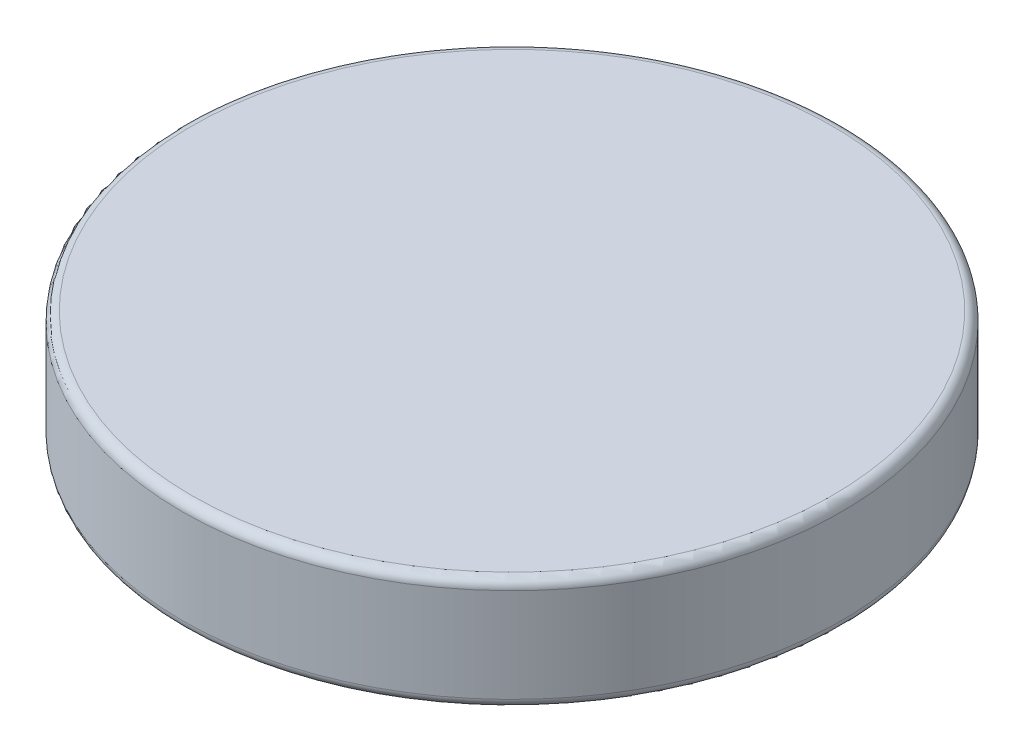
ISO-10303-21;
HEADER;
FILE_DESCRIPTION(('STEP AP214'),'2;1');
FILE_NAME('part.step','',(''),(''),'','','');
FILE_SCHEMA(('AUTOMOTIVE_DESIGN { 1 0 10303 214 1 1 1 1 }'));
ENDSEC;
DATA;
#1=APPLICATION_CONTEXT('core data for automotive mechanical design processes');
#2=APPLICATION_PROTOCOL_DEFINITION('international standard','automotive_design',2000,#1);
#3=PRODUCT_CONTEXT('',#1,'mechanical');
#4=PRODUCT('Part','Part','',(#3));
#5=PRODUCT_RELATED_PRODUCT_CATEGORY('part','',(#4));
#6=PRODUCT_DEFINITION_FORMATION('','',#4);
#7=PRODUCT_DEFINITION_CONTEXT('part definition',#1,'design');
#8=PRODUCT_DEFINITION('design','',#6,#7);
#9=PRODUCT_DEFINITION_SHAPE('','',#8);
#10=(LENGTH_UNIT() NAMED_UNIT(*) SI_UNIT(.MILLI.,.METRE.));
#11=(NAMED_UNIT(*) PLANE_ANGLE_UNIT() SI_UNIT($,.RADIAN.));
#12=(NAMED_UNIT(*) SI_UNIT($,.STERADIAN.) SOLID_ANGLE_UNIT());
#13=UNCERTAINTY_MEASURE_WITH_UNIT(LENGTH_MEASURE(1.E-05),#10,'distance_accuracy_value','');
#14=(GEOMETRIC_REPRESENTATION_CONTEXT(3) GLOBAL_UNCERTAINTY_ASSIGNED_CONTEXT((#13)) GLOBAL_UNIT_ASSIGNED_CONTEXT((#10,
#11,#12)) REPRESENTATION_CONTEXT('',''));
#15=CARTESIAN_POINT('',(0.,0.,0.));
#16=DIRECTION('',(0.,0.,1.));
#17=DIRECTION('',(1.,0.,0.));
#18=AXIS2_PLACEMENT_3D('',#15,#16,#17);
#19=CARTESIAN_POINT('',(0.,12.,0.));
#20=DIRECTION('',(0.,-1.,0.));
#21=DIRECTION('',(0.,0.,-1.));
#22=AXIS2_PLACEMENT_3D('',#19,#20,#21);
#23=CYLINDRICAL_SURFACE('',#22,35.);
#24=CARTESIAN_POINT('',(0.,1.,0.));
#25=DIRECTION('',(0.,1.,0.));
#26=DIRECTION('',(0.,0.,1.));
#27=AXIS2_PLACEMENT_3D('',#24,#25,#26);
#28=CIRCLE('',#27,35.);
#29=CARTESIAN_POINT('',(0.,1.,35.));
#30=VERTEX_POINT('',#29);
#31=EDGE_CURVE('E44',#30,#30,#28,.T.);
#32=ORIENTED_EDGE('',*,*,#31,.T.);
#33=EDGE_LOOP('',(#32));
#34=FACE_BOUND('',#33,.T.);
#35=CARTESIAN_POINT('',(0.,11.,0.));
#36=DIRECTION('',(0.,1.,0.));
#37=DIRECTION('',(0.,0.,1.));
#38=AXIS2_PLACEMENT_3D('',#35,#36,#37);
#39=CIRCLE('',#38,35.);
#40=CARTESIAN_POINT('',(0.,11.,35.));
#41=VERTEX_POINT('',#40);
#42=EDGE_CURVE('E48',#41,#41,#39,.F.);
#43=ORIENTED_EDGE('',*,*,#42,.T.);
#44=EDGE_LOOP('',(#43));
#45=FACE_BOUND('',#44,.T.);
#46=ADVANCED_FACE('F33',(#34,#45),#23,.T.);
#47=CARTESIAN_POINT('',(0.,12.,0.));
#48=DIRECTION('',(0.,1.,0.));
#49=DIRECTION('',(0.,0.,1.));
#50=AXIS2_PLACEMENT_3D('',#47,#48,#49);
#51=PLANE('',#50);
#52=CARTESIAN_POINT('',(0.,12.,0.));
#53=DIRECTION('',(0.,1.,0.));
#54=DIRECTION('',(0.,0.,1.));
#55=AXIS2_PLACEMENT_3D('',#52,#53,#54);
#56=CIRCLE('',#55,34.);
#57=CARTESIAN_POINT('',(0.,12.,34.));
#58=VERTEX_POINT('',#57);
#59=EDGE_CURVE('E10',#58,#58,#56,.T.);
#60=ORIENTED_EDGE('',*,*,#59,.T.);
#61=EDGE_LOOP('',(#60));
#62=FACE_BOUND('',#61,.T.);
#63=ADVANCED_FACE('F64',(#62),#51,.T.);
#64=CARTESIAN_POINT('',(0.,0.,0.));
#65=DIRECTION('',(0.,1.,0.));
#66=DIRECTION('',(0.,0.,1.));
#67=AXIS2_PLACEMENT_3D('',#64,#65,#66);
#68=PLANE('',#67);
#69=CARTESIAN_POINT('',(0.,0.,0.));
#70=DIRECTION('',(0.,1.,0.));
#71=DIRECTION('',(0.,0.,1.));
#72=AXIS2_PLACEMENT_3D('',#69,#70,#71);
#73=CIRCLE('',#72,34.);
#74=CARTESIAN_POINT('',(0.,0.,34.));
#75=VERTEX_POINT('',#74);
#76=EDGE_CURVE('E40',#75,#75,#73,.F.);
#77=ORIENTED_EDGE('',*,*,#76,.T.);
#78=EDGE_LOOP('',(#77));
#79=FACE_BOUND('',#78,.T.);
#80=ADVANCED_FACE('F61',(#79),#68,.F.);
#81=CARTESIAN_POINT('',(0.,1.,0.));
#82=DIRECTION('',(0.,1.,0.));
#83=DIRECTION('',(0.,0.,1.));
#84=AXIS2_PLACEMENT_3D('',#81,#82,#83);
#85=TOROIDAL_SURFACE('',#84,34.,1.);
#86=ORIENTED_EDGE('',*,*,#76,.F.);
#87=EDGE_LOOP('',(#86));
#88=FACE_BOUND('',#87,.T.);
#89=ORIENTED_EDGE('',*,*,#31,.F.);
#90=EDGE_LOOP('',(#89));
#91=FACE_BOUND('',#90,.T.);
#92=ADVANCED_FACE('F57',(#88,#91),#85,.T.);
#93=CARTESIAN_POINT('',(0.,11.,0.));
#94=DIRECTION('',(0.,1.,0.));
#95=DIRECTION('',(0.,0.,1.));
#96=AXIS2_PLACEMENT_3D('',#93,#94,#95);
#97=TOROIDAL_SURFACE('',#96,34.,1.);
#98=ORIENTED_EDGE('',*,*,#42,.F.);
#99=EDGE_LOOP('',(#98));
#100=FACE_BOUND('',#99,.T.);
#101=ORIENTED_EDGE('',*,*,#59,.F.);
#102=EDGE_LOOP('',(#101));
#103=FACE_BOUND('',#102,.T.);
#104=ADVANCED_FACE('F35',(#100,#103),#97,.T.);
#105=CLOSED_SHELL('',(#46,#63,#80,#92,#104));
#106=MANIFOLD_SOLID_BREP('B2',#105);
#107=ADVANCED_BREP_SHAPE_REPRESENTATION('',(#18,#106),#14);
#108=SHAPE_DEFINITION_REPRESENTATION(#9,#107);
ENDSEC;
END-ISO-10303-21;
